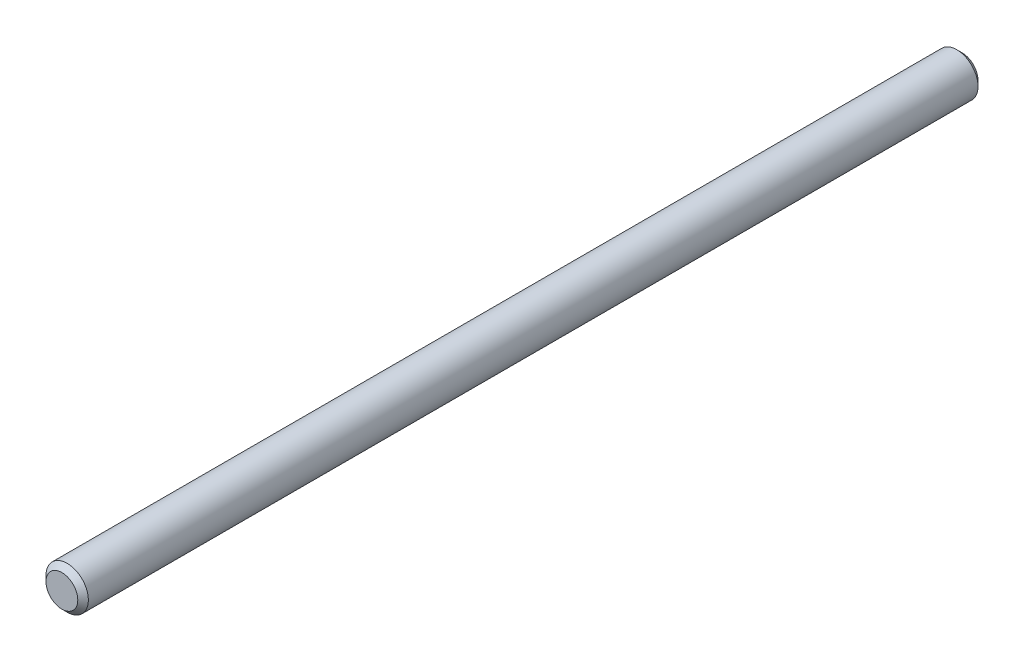
ISO-10303-21;
HEADER;
FILE_DESCRIPTION(('STEP AP214'),'2;1');
FILE_NAME('part.step','',(''),(''),'','','');
FILE_SCHEMA(('AUTOMOTIVE_DESIGN { 1 0 10303 214 1 1 1 1 }'));
ENDSEC;
DATA;
#1=APPLICATION_CONTEXT('core data for automotive mechanical design processes');
#2=APPLICATION_PROTOCOL_DEFINITION('international standard','automotive_design',2000,#1);
#3=PRODUCT_CONTEXT('',#1,'mechanical');
#4=PRODUCT('Part','Part','',(#3));
#5=PRODUCT_RELATED_PRODUCT_CATEGORY('part','',(#4));
#6=PRODUCT_DEFINITION_FORMATION('','',#4);
#7=PRODUCT_DEFINITION_CONTEXT('part definition',#1,'design');
#8=PRODUCT_DEFINITION('design','',#6,#7);
#9=PRODUCT_DEFINITION_SHAPE('','',#8);
#10=(LENGTH_UNIT() NAMED_UNIT(*) SI_UNIT(.MILLI.,.METRE.));
#11=(NAMED_UNIT(*) PLANE_ANGLE_UNIT() SI_UNIT($,.RADIAN.));
#12=(NAMED_UNIT(*) SI_UNIT($,.STERADIAN.) SOLID_ANGLE_UNIT());
#13=UNCERTAINTY_MEASURE_WITH_UNIT(LENGTH_MEASURE(1.E-05),#10,'distance_accuracy_value','');
#14=(GEOMETRIC_REPRESENTATION_CONTEXT(3) GLOBAL_UNCERTAINTY_ASSIGNED_CONTEXT((#13)) GLOBAL_UNIT_ASSIGNED_CONTEXT((#10,
#11,#12)) REPRESENTATION_CONTEXT('',''));
#15=CARTESIAN_POINT('',(0.,0.,0.));
#16=DIRECTION('',(0.,0.,1.));
#17=DIRECTION('',(1.,0.,0.));
#18=AXIS2_PLACEMENT_3D('',#15,#16,#17);
#19=CARTESIAN_POINT('',(-40.,-27.,85.));
#20=DIRECTION('',(0.,0.,-1.));
#21=DIRECTION('',(-1.,0.,0.));
#22=AXIS2_PLACEMENT_3D('',#19,#20,#21);
#23=CYLINDRICAL_SURFACE('',#22,4.);
#24=CARTESIAN_POINT('',(-40.,-27.,-84.));
#25=DIRECTION('',(0.,0.,1.));
#26=DIRECTION('',(1.,0.,0.));
#27=AXIS2_PLACEMENT_3D('',#24,#25,#26);
#28=CIRCLE('',#27,4.);
#29=CARTESIAN_POINT('',(-36.,-27.,-84.));
#30=VERTEX_POINT('',#29);
#31=EDGE_CURVE('E41',#30,#30,#28,.T.);
#32=ORIENTED_EDGE('',*,*,#31,.T.);
#33=EDGE_LOOP('',(#32));
#34=FACE_BOUND('',#33,.T.);
#35=CARTESIAN_POINT('',(-40.,-27.,84.));
#36=DIRECTION('',(0.,0.,1.));
#37=DIRECTION('',(1.,0.,0.));
#38=AXIS2_PLACEMENT_3D('',#35,#36,#37);
#39=CIRCLE('',#38,4.);
#40=CARTESIAN_POINT('',(-36.,-27.,84.));
#41=VERTEX_POINT('',#40);
#42=EDGE_CURVE('E45',#41,#41,#39,.F.);
#43=ORIENTED_EDGE('',*,*,#42,.T.);
#44=EDGE_LOOP('',(#43));
#45=FACE_BOUND('',#44,.T.);
#46=ADVANCED_FACE('F30',(#34,#45),#23,.T.);
#47=CARTESIAN_POINT('',(-40.,-27.,85.));
#48=DIRECTION('',(0.,0.,1.));
#49=DIRECTION('',(1.,0.,0.));
#50=AXIS2_PLACEMENT_3D('',#47,#48,#49);
#51=PLANE('',#50);
#52=CARTESIAN_POINT('',(-40.,-27.,85.));
#53=DIRECTION('',(0.,0.,1.));
#54=DIRECTION('',(1.,0.,0.));
#55=AXIS2_PLACEMENT_3D('',#52,#53,#54);
#56=CIRCLE('',#55,3.00000000000002);
#57=CARTESIAN_POINT('',(-37.,-27.,85.));
#58=VERTEX_POINT('',#57);
#59=EDGE_CURVE('E10',#58,#58,#56,.T.);
#60=ORIENTED_EDGE('',*,*,#59,.T.);
#61=EDGE_LOOP('',(#60));
#62=FACE_BOUND('',#61,.T.);
#63=ADVANCED_FACE('F61',(#62),#51,.T.);
#64=CARTESIAN_POINT('',(-40.,-27.,-85.));
#65=DIRECTION('',(0.,0.,1.));
#66=DIRECTION('',(1.,0.,0.));
#67=AXIS2_PLACEMENT_3D('',#64,#65,#66);
#68=PLANE('',#67);
#69=CARTESIAN_POINT('',(-40.,-27.,-85.));
#70=DIRECTION('',(0.,0.,1.));
#71=DIRECTION('',(1.,0.,0.));
#72=AXIS2_PLACEMENT_3D('',#69,#70,#71);
#73=CIRCLE('',#72,2.99999999999999);
#74=CARTESIAN_POINT('',(-37.,-27.,-85.));
#75=VERTEX_POINT('',#74);
#76=EDGE_CURVE('E37',#75,#75,#73,.F.);
#77=ORIENTED_EDGE('',*,*,#76,.T.);
#78=EDGE_LOOP('',(#77));
#79=FACE_BOUND('',#78,.T.);
#80=ADVANCED_FACE('F58',(#79),#68,.F.);
#81=CARTESIAN_POINT('',(-40.,-27.,-84.));
#82=DIRECTION('',(0.,0.,1.));
#83=DIRECTION('',(1.,0.,0.));
#84=AXIS2_PLACEMENT_3D('',#81,#82,#83);
#85=CONICAL_SURFACE('',#84,4.,0.785398163397439);
#86=ORIENTED_EDGE('',*,*,#76,.F.);
#87=EDGE_LOOP('',(#86));
#88=FACE_BOUND('',#87,.T.);
#89=ORIENTED_EDGE('',*,*,#31,.F.);
#90=EDGE_LOOP('',(#89));
#91=FACE_BOUND('',#90,.T.);
#92=ADVANCED_FACE('F54',(#88,#91),#85,.T.);
#93=CARTESIAN_POINT('',(-40.,-27.,85.));
#94=DIRECTION('',(0.,0.,-1.));
#95=DIRECTION('',(-1.,0.,0.));
#96=AXIS2_PLACEMENT_3D('',#93,#94,#95);
#97=CONICAL_SURFACE('',#96,3.00000000000002,0.785398163397439);
#98=ORIENTED_EDGE('',*,*,#42,.F.);
#99=EDGE_LOOP('',(#98));
#100=FACE_BOUND('',#99,.T.);
#101=ORIENTED_EDGE('',*,*,#59,.F.);
#102=EDGE_LOOP('',(#101));
#103=FACE_BOUND('',#102,.T.);
#104=ADVANCED_FACE('F32',(#100,#103),#97,.T.);
#105=CLOSED_SHELL('',(#46,#63,#80,#92,#104));
#106=MANIFOLD_SOLID_BREP('B2',#105);
#107=ADVANCED_BREP_SHAPE_REPRESENTATION('',(#18,#106),#14);
#108=SHAPE_DEFINITION_REPRESENTATION(#9,#107);
ENDSEC;
END-ISO-10303-21;
